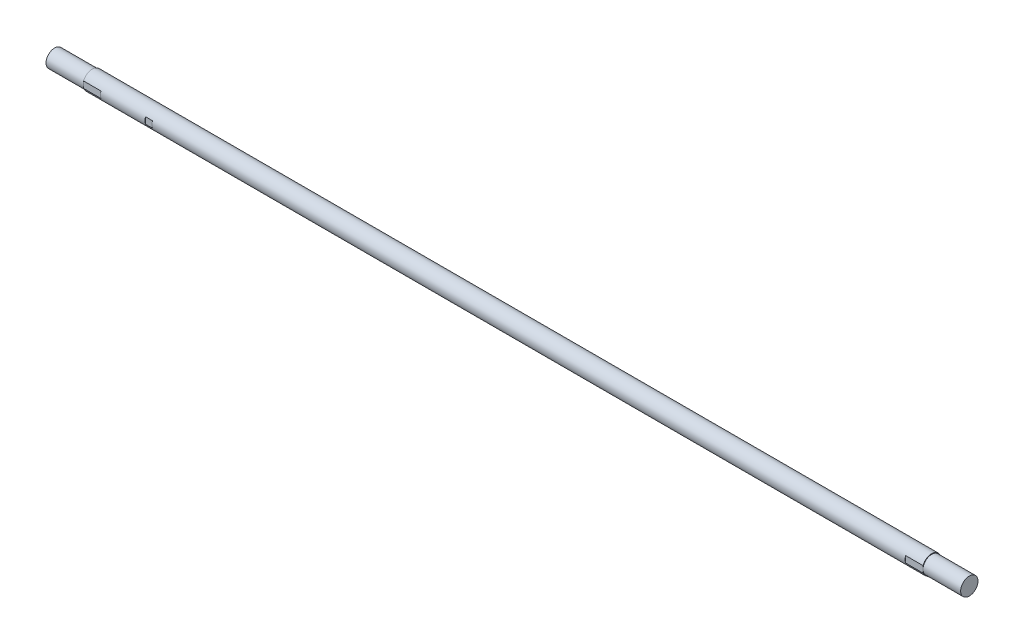
ISO-10303-21;
HEADER;
FILE_DESCRIPTION(('STEP AP214'),'2;1');
FILE_NAME('part.step','',(''),(''),'','','');
FILE_SCHEMA(('AUTOMOTIVE_DESIGN { 1 0 10303 214 1 1 1 1 }'));
ENDSEC;
DATA;
#1=APPLICATION_CONTEXT('core data for automotive mechanical design processes');
#2=APPLICATION_PROTOCOL_DEFINITION('international standard','automotive_design',2000,#1);
#3=PRODUCT_CONTEXT('',#1,'mechanical');
#4=PRODUCT('Part','Part','',(#3));
#5=PRODUCT_RELATED_PRODUCT_CATEGORY('part','',(#4));
#6=PRODUCT_DEFINITION_FORMATION('','',#4);
#7=PRODUCT_DEFINITION_CONTEXT('part definition',#1,'design');
#8=PRODUCT_DEFINITION('design','',#6,#7);
#9=PRODUCT_DEFINITION_SHAPE('','',#8);
#10=(LENGTH_UNIT() NAMED_UNIT(*) SI_UNIT(.MILLI.,.METRE.));
#11=(NAMED_UNIT(*) PLANE_ANGLE_UNIT() SI_UNIT($,.RADIAN.));
#12=(NAMED_UNIT(*) SI_UNIT($,.STERADIAN.) SOLID_ANGLE_UNIT());
#13=UNCERTAINTY_MEASURE_WITH_UNIT(LENGTH_MEASURE(1.E-05),#10,'distance_accuracy_value','');
#14=(GEOMETRIC_REPRESENTATION_CONTEXT(3) GLOBAL_UNCERTAINTY_ASSIGNED_CONTEXT((#13)) GLOBAL_UNIT_ASSIGNED_CONTEXT((#10,
#11,#12)) REPRESENTATION_CONTEXT('',''));
#15=CARTESIAN_POINT('',(0.,0.,0.));
#16=DIRECTION('',(0.,0.,1.));
#17=DIRECTION('',(1.,0.,0.));
#18=AXIS2_PLACEMENT_3D('',#15,#16,#17);
#19=CARTESIAN_POINT('',(790.0052,8.0027,8.));
#20=DIRECTION('',(1.,0.,0.));
#21=DIRECTION('',(0.,0.,-1.));
#22=AXIS2_PLACEMENT_3D('',#19,#20,#21);
#23=PLANE('',#22);
#24=CARTESIAN_POINT('',(790.0052,8.0027,8.));
#25=DIRECTION('',(1.,0.,0.));
#26=DIRECTION('',(0.,0.,-1.));
#27=AXIS2_PLACEMENT_3D('',#24,#25,#26);
#28=CIRCLE('',#27,7.5);
#29=CARTESIAN_POINT('',(790.0052,8.0027,0.5));
#30=VERTEX_POINT('',#29);
#31=EDGE_CURVE('E18',#30,#30,#28,.F.);
#32=ORIENTED_EDGE('',*,*,#31,.F.);
#33=EDGE_LOOP('',(#32));
#34=FACE_BOUND('',#33,.T.);
#35=ADVANCED_FACE('F15',(#34),#23,.T.);
#36=CARTESIAN_POINT('',(0.005200000000002,8.0027,8.));
#37=DIRECTION('',(1.,0.,0.));
#38=DIRECTION('',(0.,0.,-1.));
#39=AXIS2_PLACEMENT_3D('',#36,#37,#38);
#40=PLANE('',#39);
#41=CARTESIAN_POINT('',(0.005200000000002,8.0027,8.));
#42=DIRECTION('',(1.,0.,0.));
#43=DIRECTION('',(0.,0.,-1.));
#44=AXIS2_PLACEMENT_3D('',#41,#42,#43);
#45=CIRCLE('',#44,7.5);
#46=CARTESIAN_POINT('',(0.005200000000002,8.0027,0.5));
#47=VERTEX_POINT('',#46);
#48=EDGE_CURVE('E120',#47,#47,#45,.T.);
#49=ORIENTED_EDGE('',*,*,#48,.F.);
#50=EDGE_LOOP('',(#49));
#51=FACE_BOUND('',#50,.T.);
#52=ADVANCED_FACE('F131',(#51),#40,.F.);
#53=CARTESIAN_POINT('',(0.005200000000002,8.0027,8.));
#54=DIRECTION('',(1.,0.,0.));
#55=DIRECTION('',(0.,0.,-1.));
#56=AXIS2_PLACEMENT_3D('',#53,#54,#55);
#57=CYLINDRICAL_SURFACE('',#56,7.5);
#58=ORIENTED_EDGE('',*,*,#31,.T.);
#59=EDGE_LOOP('',(#58));
#60=FACE_BOUND('',#59,.T.);
#61=CARTESIAN_POINT('',(757.5052,8.0027,8.));
#62=DIRECTION('',(1.,0.,0.));
#63=DIRECTION('',(0.,0.,-1.));
#64=AXIS2_PLACEMENT_3D('',#61,#62,#63);
#65=CIRCLE('',#64,7.5);
#66=CARTESIAN_POINT('',(757.5052,8.0027,0.5));
#67=VERTEX_POINT('',#66);
#68=EDGE_CURVE('E118',#67,#67,#65,.F.);
#69=ORIENTED_EDGE('',*,*,#68,.F.);
#70=EDGE_LOOP('',(#69));
#71=FACE_BOUND('',#70,.T.);
#72=ADVANCED_FACE('F127',(#60,#71),#57,.T.);
#73=CARTESIAN_POINT('',(0.005200000000002,8.0027,8.));
#74=DIRECTION('',(1.,0.,0.));
#75=DIRECTION('',(0.,0.,-1.));
#76=AXIS2_PLACEMENT_3D('',#73,#74,#75);
#77=CYLINDRICAL_SURFACE('',#76,7.5);
#78=ORIENTED_EDGE('',*,*,#48,.T.);
#79=EDGE_LOOP('',(#78));
#80=FACE_BOUND('',#79,.T.);
#81=CARTESIAN_POINT('',(32.5052,8.0027,8.));
#82=DIRECTION('',(1.,0.,0.));
#83=DIRECTION('',(0.,0.,-1.));
#84=AXIS2_PLACEMENT_3D('',#81,#82,#83);
#85=CIRCLE('',#84,7.5);
#86=CARTESIAN_POINT('',(32.5052,8.0027,0.5));
#87=VERTEX_POINT('',#86);
#88=EDGE_CURVE('E75',#87,#87,#85,.F.);
#89=ORIENTED_EDGE('',*,*,#88,.T.);
#90=EDGE_LOOP('',(#89));
#91=FACE_BOUND('',#90,.T.);
#92=ADVANCED_FACE('F174',(#80,#91),#77,.T.);
#93=CARTESIAN_POINT('',(757.5052,8.0027,8.));
#94=DIRECTION('',(1.,0.,0.));
#95=DIRECTION('',(0.,0.,-1.));
#96=AXIS2_PLACEMENT_3D('',#93,#94,#95);
#97=PLANE('',#96);
#98=ORIENTED_EDGE('',*,*,#68,.T.);
#99=EDGE_LOOP('',(#98));
#100=FACE_BOUND('',#99,.T.);
#101=CARTESIAN_POINT('',(757.5052,8.0027,8.));
#102=DIRECTION('',(1.,0.,0.));
#103=DIRECTION('',(0.,0.,-1.));
#104=AXIS2_PLACEMENT_3D('',#101,#102,#103);
#105=CIRCLE('',#104,8.);
#106=CARTESIAN_POINT('',(757.5052,10.786582181415,15.5));
#107=VERTEX_POINT('',#106);
#108=CARTESIAN_POINT('',(757.5052,5.218817818585,15.5));
#109=VERTEX_POINT('',#108);
#110=EDGE_CURVE('E96',#107,#109,#105,.F.);
#111=ORIENTED_EDGE('',*,*,#110,.F.);
#112=DIRECTION('',(0.,1.,0.));
#113=VECTOR('',#112,1.);
#114=CARTESIAN_POINT('',(757.5052,-1.9973,15.5));
#115=LINE('',#114,#113);
#116=EDGE_CURVE('E48',#109,#107,#115,.T.);
#117=ORIENTED_EDGE('',*,*,#116,.F.);
#118=EDGE_LOOP('',(#111,#117));
#119=FACE_BOUND('',#118,.T.);
#120=ADVANCED_FACE('F171',(#100,#119),#97,.T.);
#121=CARTESIAN_POINT('',(742.5052,-1.9973,15.5));
#122=DIRECTION('',(0.,0.,1.));
#123=DIRECTION('',(1.,0.,0.));
#124=AXIS2_PLACEMENT_3D('',#121,#122,#123);
#125=PLANE('',#124);
#126=ORIENTED_EDGE('',*,*,#116,.T.);
#127=DIRECTION('',(1.,0.,0.));
#128=VECTOR('',#127,1.);
#129=CARTESIAN_POINT('',(32.5052,10.786582181415,15.5));
#130=LINE('',#129,#128);
#131=CARTESIAN_POINT('',(742.5052,10.786582181415,15.5));
#132=VERTEX_POINT('',#131);
#133=EDGE_CURVE('E97',#132,#107,#130,.T.);
#134=ORIENTED_EDGE('',*,*,#133,.F.);
#135=DIRECTION('',(0.,1.,0.));
#136=VECTOR('',#135,1.);
#137=CARTESIAN_POINT('',(742.5052,-1.9973,15.5));
#138=LINE('',#137,#136);
#139=CARTESIAN_POINT('',(742.5052,5.218817818585,15.5));
#140=VERTEX_POINT('',#139);
#141=EDGE_CURVE('E57',#140,#132,#138,.T.);
#142=ORIENTED_EDGE('',*,*,#141,.F.);
#143=DIRECTION('',(1.,0.,0.));
#144=VECTOR('',#143,1.);
#145=CARTESIAN_POINT('',(32.5052,5.218817818585,15.5));
#146=LINE('',#145,#144);
#147=EDGE_CURVE('E85',#109,#140,#146,.F.);
#148=ORIENTED_EDGE('',*,*,#147,.F.);
#149=EDGE_LOOP('',(#126,#134,#142,#148));
#150=FACE_BOUND('',#149,.T.);
#151=ADVANCED_FACE('F168',(#150),#125,.T.);
#152=CARTESIAN_POINT('',(742.5052,-1.9973,15.5));
#153=DIRECTION('',(1.,0.,0.));
#154=DIRECTION('',(0.,0.,-1.));
#155=AXIS2_PLACEMENT_3D('',#152,#153,#154);
#156=PLANE('',#155);
#157=ORIENTED_EDGE('',*,*,#141,.T.);
#158=CARTESIAN_POINT('',(742.5052,8.0027,8.));
#159=DIRECTION('',(1.,0.,0.));
#160=DIRECTION('',(0.,0.,-1.));
#161=AXIS2_PLACEMENT_3D('',#158,#159,#160);
#162=CIRCLE('',#161,8.);
#163=EDGE_CURVE('E100',#140,#132,#162,.F.);
#164=ORIENTED_EDGE('',*,*,#163,.F.);
#165=EDGE_LOOP('',(#157,#164));
#166=FACE_BOUND('',#165,.T.);
#167=ADVANCED_FACE('F164',(#166),#156,.T.);
#168=CARTESIAN_POINT('',(92.0052,-1.9973,15.5));
#169=DIRECTION('',(1.,0.,0.));
#170=DIRECTION('',(0.,0.,-1.));
#171=AXIS2_PLACEMENT_3D('',#168,#169,#170);
#172=PLANE('',#171);
#173=DIRECTION('',(0.,1.,0.));
#174=VECTOR('',#173,1.);
#175=CARTESIAN_POINT('',(92.0052,-1.9973,15.5));
#176=LINE('',#175,#174);
#177=CARTESIAN_POINT('',(92.0052,5.218817818585,15.5));
#178=VERTEX_POINT('',#177);
#179=CARTESIAN_POINT('',(92.0052,10.786582181415,15.5));
#180=VERTEX_POINT('',#179);
#181=EDGE_CURVE('E90',#178,#180,#176,.T.);
#182=ORIENTED_EDGE('',*,*,#181,.F.);
#183=CARTESIAN_POINT('',(92.0052,8.0027,8.));
#184=DIRECTION('',(1.,0.,0.));
#185=DIRECTION('',(0.,0.,-1.));
#186=AXIS2_PLACEMENT_3D('',#183,#184,#185);
#187=CIRCLE('',#186,8.);
#188=EDGE_CURVE('E103',#180,#178,#187,.T.);
#189=ORIENTED_EDGE('',*,*,#188,.F.);
#190=EDGE_LOOP('',(#182,#189));
#191=FACE_BOUND('',#190,.T.);
#192=ADVANCED_FACE('F160',(#191),#172,.F.);
#193=CARTESIAN_POINT('',(86.0052,-1.9973,15.5));
#194=DIRECTION('',(0.,0.,1.));
#195=DIRECTION('',(1.,0.,0.));
#196=AXIS2_PLACEMENT_3D('',#193,#194,#195);
#197=PLANE('',#196);
#198=ORIENTED_EDGE('',*,*,#181,.T.);
#199=DIRECTION('',(1.,0.,0.));
#200=VECTOR('',#199,1.);
#201=CARTESIAN_POINT('',(32.5052,10.786582181415,15.5));
#202=LINE('',#201,#200);
#203=CARTESIAN_POINT('',(86.0052,10.786582181415,15.5));
#204=VERTEX_POINT('',#203);
#205=EDGE_CURVE('E101',#204,#180,#202,.T.);
#206=ORIENTED_EDGE('',*,*,#205,.F.);
#207=DIRECTION('',(0.,1.,0.));
#208=VECTOR('',#207,1.);
#209=CARTESIAN_POINT('',(86.0052,-1.9973,15.5));
#210=LINE('',#209,#208);
#211=CARTESIAN_POINT('',(86.0052,5.218817818585,15.5));
#212=VERTEX_POINT('',#211);
#213=EDGE_CURVE('E89',#212,#204,#210,.T.);
#214=ORIENTED_EDGE('',*,*,#213,.F.);
#215=DIRECTION('',(1.,0.,0.));
#216=VECTOR('',#215,1.);
#217=CARTESIAN_POINT('',(32.5052,5.218817818585,15.5));
#218=LINE('',#217,#216);
#219=EDGE_CURVE('E82',#178,#212,#218,.F.);
#220=ORIENTED_EDGE('',*,*,#219,.F.);
#221=EDGE_LOOP('',(#198,#206,#214,#220));
#222=FACE_BOUND('',#221,.T.);
#223=ADVANCED_FACE('F156',(#222),#197,.T.);
#224=CARTESIAN_POINT('',(86.0052,-1.9973,15.5));
#225=DIRECTION('',(1.,0.,0.));
#226=DIRECTION('',(0.,0.,-1.));
#227=AXIS2_PLACEMENT_3D('',#224,#225,#226);
#228=PLANE('',#227);
#229=ORIENTED_EDGE('',*,*,#213,.T.);
#230=CARTESIAN_POINT('',(86.0052,8.0027,8.));
#231=DIRECTION('',(1.,0.,0.));
#232=DIRECTION('',(0.,0.,-1.));
#233=AXIS2_PLACEMENT_3D('',#230,#231,#232);
#234=CIRCLE('',#233,8.);
#235=EDGE_CURVE('E104',#212,#204,#234,.F.);
#236=ORIENTED_EDGE('',*,*,#235,.F.);
#237=EDGE_LOOP('',(#229,#236));
#238=FACE_BOUND('',#237,.T.);
#239=ADVANCED_FACE('F152',(#238),#228,.T.);
#240=CARTESIAN_POINT('',(47.5052,-1.9973,15.5));
#241=DIRECTION('',(1.,0.,0.));
#242=DIRECTION('',(0.,0.,-1.));
#243=AXIS2_PLACEMENT_3D('',#240,#241,#242);
#244=PLANE('',#243);
#245=DIRECTION('',(0.,1.,0.));
#246=VECTOR('',#245,1.);
#247=CARTESIAN_POINT('',(47.5052,-1.9973,15.5));
#248=LINE('',#247,#246);
#249=CARTESIAN_POINT('',(47.5052,5.218817818585,15.5));
#250=VERTEX_POINT('',#249);
#251=CARTESIAN_POINT('',(47.5052,10.786582181415,15.5));
#252=VERTEX_POINT('',#251);
#253=EDGE_CURVE('E68',#250,#252,#248,.T.);
#254=ORIENTED_EDGE('',*,*,#253,.F.);
#255=CARTESIAN_POINT('',(47.5052,8.0027,8.));
#256=DIRECTION('',(1.,0.,0.));
#257=DIRECTION('',(0.,0.,-1.));
#258=AXIS2_PLACEMENT_3D('',#255,#256,#257);
#259=CIRCLE('',#258,8.);
#260=EDGE_CURVE('E74',#252,#250,#259,.T.);
#261=ORIENTED_EDGE('',*,*,#260,.F.);
#262=EDGE_LOOP('',(#254,#261));
#263=FACE_BOUND('',#262,.T.);
#264=ADVANCED_FACE('F149',(#263),#244,.F.);
#265=CARTESIAN_POINT('',(32.5052,-1.9973,15.5));
#266=DIRECTION('',(0.,0.,1.));
#267=DIRECTION('',(1.,0.,0.));
#268=AXIS2_PLACEMENT_3D('',#265,#266,#267);
#269=PLANE('',#268);
#270=DIRECTION('',(1.,0.,0.));
#271=VECTOR('',#270,1.);
#272=CARTESIAN_POINT('',(32.5052,10.786582181415,15.5));
#273=LINE('',#272,#271);
#274=CARTESIAN_POINT('',(32.5052,10.786582181415,15.5));
#275=VERTEX_POINT('',#274);
#276=EDGE_CURVE('E71',#275,#252,#273,.T.);
#277=ORIENTED_EDGE('',*,*,#276,.F.);
#278=DIRECTION('',(0.,1.,0.));
#279=VECTOR('',#278,1.);
#280=CARTESIAN_POINT('',(32.5052,-1.9973,15.5));
#281=LINE('',#280,#279);
#282=CARTESIAN_POINT('',(32.5052,5.218817818585,15.5));
#283=VERTEX_POINT('',#282);
#284=EDGE_CURVE('E33',#275,#283,#281,.F.);
#285=ORIENTED_EDGE('',*,*,#284,.T.);
#286=DIRECTION('',(1.,0.,0.));
#287=VECTOR('',#286,1.);
#288=CARTESIAN_POINT('',(32.5052,5.218817818585,15.5));
#289=LINE('',#288,#287);
#290=EDGE_CURVE('E24',#250,#283,#289,.F.);
#291=ORIENTED_EDGE('',*,*,#290,.F.);
#292=ORIENTED_EDGE('',*,*,#253,.T.);
#293=EDGE_LOOP('',(#277,#285,#291,#292));
#294=FACE_BOUND('',#293,.T.);
#295=ADVANCED_FACE('F72',(#294),#269,.T.);
#296=CARTESIAN_POINT('',(32.5052,8.0027,8.));
#297=DIRECTION('',(1.,0.,0.));
#298=DIRECTION('',(0.,0.,-1.));
#299=AXIS2_PLACEMENT_3D('',#296,#297,#298);
#300=PLANE('',#299);
#301=ORIENTED_EDGE('',*,*,#88,.F.);
#302=EDGE_LOOP('',(#301));
#303=FACE_BOUND('',#302,.T.);
#304=CARTESIAN_POINT('',(32.5052,8.0027,8.));
#305=DIRECTION('',(1.,0.,0.));
#306=DIRECTION('',(0.,0.,-1.));
#307=AXIS2_PLACEMENT_3D('',#304,#305,#306);
#308=CIRCLE('',#307,8.);
#309=EDGE_CURVE('E9',#283,#275,#308,.T.);
#310=ORIENTED_EDGE('',*,*,#309,.F.);
#311=ORIENTED_EDGE('',*,*,#284,.F.);
#312=EDGE_LOOP('',(#310,#311));
#313=FACE_BOUND('',#312,.T.);
#314=ADVANCED_FACE('F78',(#303,#313),#300,.F.);
#315=CARTESIAN_POINT('',(32.5052,8.0027,8.));
#316=DIRECTION('',(1.,0.,0.));
#317=DIRECTION('',(0.,0.,-1.));
#318=AXIS2_PLACEMENT_3D('',#315,#316,#317);
#319=CYLINDRICAL_SURFACE('',#318,8.);
#320=ORIENTED_EDGE('',*,*,#219,.T.);
#321=ORIENTED_EDGE('',*,*,#235,.T.);
#322=ORIENTED_EDGE('',*,*,#205,.T.);
#323=ORIENTED_EDGE('',*,*,#188,.T.);
#324=EDGE_LOOP('',(#320,#321,#322,#323));
#325=FACE_BOUND('',#324,.T.);
#326=ORIENTED_EDGE('',*,*,#147,.T.);
#327=ORIENTED_EDGE('',*,*,#163,.T.);
#328=ORIENTED_EDGE('',*,*,#133,.T.);
#329=ORIENTED_EDGE('',*,*,#110,.T.);
#330=EDGE_LOOP('',(#326,#327,#328,#329));
#331=FACE_BOUND('',#330,.T.);
#332=ORIENTED_EDGE('',*,*,#290,.T.);
#333=ORIENTED_EDGE('',*,*,#309,.T.);
#334=ORIENTED_EDGE('',*,*,#276,.T.);
#335=ORIENTED_EDGE('',*,*,#260,.T.);
#336=EDGE_LOOP('',(#332,#333,#334,#335));
#337=FACE_BOUND('',#336,.T.);
#338=ADVANCED_FACE('F81',(#325,#331,#337),#319,.T.);
#339=CLOSED_SHELL('',(#35,#52,#72,#92,#120,#151,#167,#192,#223,#239,#264,#295,#314,#338));
#340=MANIFOLD_SOLID_BREP('B1',#339);
#341=ADVANCED_BREP_SHAPE_REPRESENTATION('',(#18,#340),#14);
#342=SHAPE_DEFINITION_REPRESENTATION(#9,#341);
ENDSEC;
END-ISO-10303-21;
